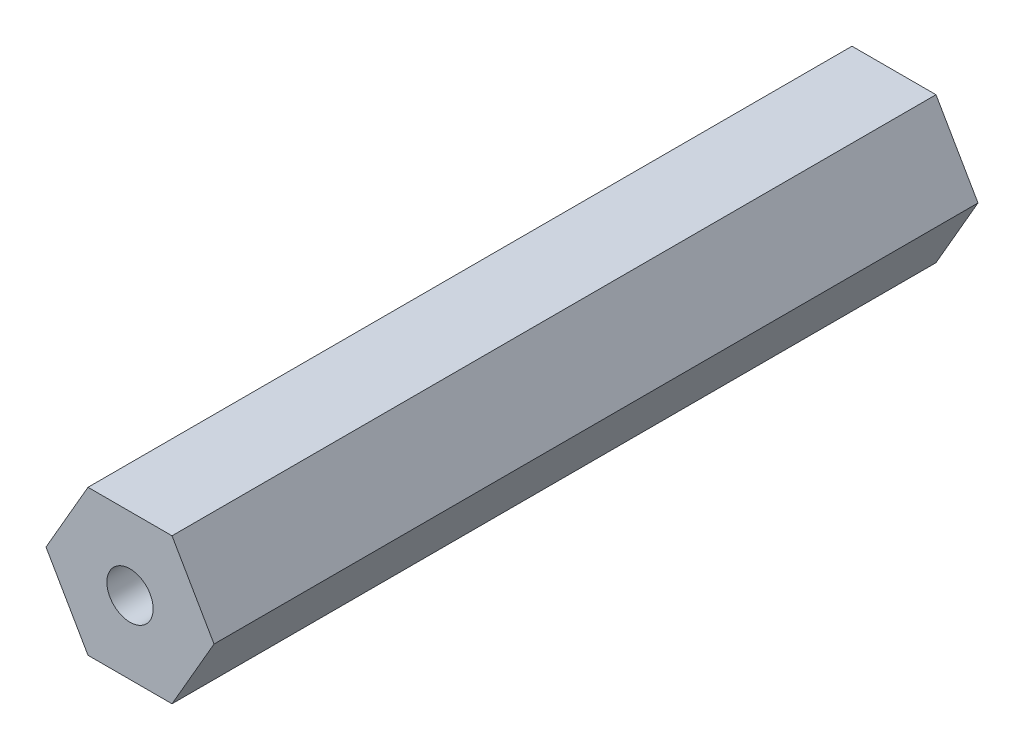
ISO-10303-21;
HEADER;
FILE_DESCRIPTION(('STEP AP214'),'2;1');
FILE_NAME('part.step','',(''),(''),'','','');
FILE_SCHEMA(('AUTOMOTIVE_DESIGN { 1 0 10303 214 1 1 1 1 }'));
ENDSEC;
DATA;
#1=APPLICATION_CONTEXT('core data for automotive mechanical design processes');
#2=APPLICATION_PROTOCOL_DEFINITION('international standard','automotive_design',2000,#1);
#3=PRODUCT_CONTEXT('',#1,'mechanical');
#4=PRODUCT('Part','Part','',(#3));
#5=PRODUCT_RELATED_PRODUCT_CATEGORY('part','',(#4));
#6=PRODUCT_DEFINITION_FORMATION('','',#4);
#7=PRODUCT_DEFINITION_CONTEXT('part definition',#1,'design');
#8=PRODUCT_DEFINITION('design','',#6,#7);
#9=PRODUCT_DEFINITION_SHAPE('','',#8);
#10=(LENGTH_UNIT() NAMED_UNIT(*) SI_UNIT(.MILLI.,.METRE.));
#11=(NAMED_UNIT(*) PLANE_ANGLE_UNIT() SI_UNIT($,.RADIAN.));
#12=(NAMED_UNIT(*) SI_UNIT($,.STERADIAN.) SOLID_ANGLE_UNIT());
#13=UNCERTAINTY_MEASURE_WITH_UNIT(LENGTH_MEASURE(1.E-05),#10,'distance_accuracy_value','');
#14=(GEOMETRIC_REPRESENTATION_CONTEXT(3) GLOBAL_UNCERTAINTY_ASSIGNED_CONTEXT((#13)) GLOBAL_UNIT_ASSIGNED_CONTEXT((#10,
#11,#12)) REPRESENTATION_CONTEXT('',''));
#15=CARTESIAN_POINT('',(0.,0.,0.));
#16=DIRECTION('',(0.,0.,1.));
#17=DIRECTION('',(1.,0.,0.));
#18=AXIS2_PLACEMENT_3D('',#15,#16,#17);
#19=CARTESIAN_POINT('',(-3.66617420935412,6.35,33.3375));
#20=DIRECTION('',(0.866025403784439,-0.5,0.));
#21=DIRECTION('',(0.5,0.866025403784439,0.));
#22=AXIS2_PLACEMENT_3D('',#19,#20,#21);
#23=PLANE('',#22);
#24=DIRECTION('',(-0.5,-0.866025403784439,0.));
#25=VECTOR('',#24,1.);
#26=CARTESIAN_POINT('',(-3.66617420935412,6.35,-33.3375));
#27=LINE('',#26,#25);
#28=CARTESIAN_POINT('',(-3.66617420935412,6.35,-33.3375));
#29=VERTEX_POINT('',#28);
#30=CARTESIAN_POINT('',(-7.33234841870825,0.,-33.3375));
#31=VERTEX_POINT('',#30);
#32=EDGE_CURVE('E128',#29,#31,#27,.T.);
#33=ORIENTED_EDGE('',*,*,#32,.T.);
#34=DIRECTION('',(0.,0.,-1.));
#35=VECTOR('',#34,1.);
#36=CARTESIAN_POINT('',(-7.33234841870825,0.,33.3375));
#37=LINE('',#36,#35);
#38=CARTESIAN_POINT('',(-7.33234841870825,0.,33.3375));
#39=VERTEX_POINT('',#38);
#40=EDGE_CURVE('E11',#39,#31,#37,.T.);
#41=ORIENTED_EDGE('',*,*,#40,.F.);
#42=DIRECTION('',(-0.5,-0.866025403784439,0.));
#43=VECTOR('',#42,1.);
#44=CARTESIAN_POINT('',(-3.66617420935412,6.35,33.3375));
#45=LINE('',#44,#43);
#46=CARTESIAN_POINT('',(-3.66617420935412,6.35,33.3375));
#47=VERTEX_POINT('',#46);
#48=EDGE_CURVE('E139',#47,#39,#45,.T.);
#49=ORIENTED_EDGE('',*,*,#48,.F.);
#50=DIRECTION('',(0.,0.,-1.));
#51=VECTOR('',#50,1.);
#52=CARTESIAN_POINT('',(-3.66617420935412,6.35,33.3375));
#53=LINE('',#52,#51);
#54=EDGE_CURVE('E124',#47,#29,#53,.T.);
#55=ORIENTED_EDGE('',*,*,#54,.T.);
#56=EDGE_LOOP('',(#33,#41,#49,#55));
#57=FACE_BOUND('',#56,.T.);
#58=ADVANCED_FACE('F41',(#57),#23,.F.);
#59=CARTESIAN_POINT('',(-7.33234841870825,0.,33.3375));
#60=DIRECTION('',(0.866025403784439,0.5,0.));
#61=DIRECTION('',(-0.5,0.866025403784439,0.));
#62=AXIS2_PLACEMENT_3D('',#59,#60,#61);
#63=PLANE('',#62);
#64=DIRECTION('',(0.5,-0.866025403784439,0.));
#65=VECTOR('',#64,1.);
#66=CARTESIAN_POINT('',(-7.33234841870825,0.,-33.3375));
#67=LINE('',#66,#65);
#68=CARTESIAN_POINT('',(-3.66617420935412,-6.35,-33.3375));
#69=VERTEX_POINT('',#68);
#70=EDGE_CURVE('E131',#31,#69,#67,.T.);
#71=ORIENTED_EDGE('',*,*,#70,.T.);
#72=DIRECTION('',(0.,0.,-1.));
#73=VECTOR('',#72,1.);
#74=CARTESIAN_POINT('',(-3.66617420935412,-6.35,33.3375));
#75=LINE('',#74,#73);
#76=CARTESIAN_POINT('',(-3.66617420935412,-6.35,33.3375));
#77=VERTEX_POINT('',#76);
#78=EDGE_CURVE('E49',#77,#69,#75,.T.);
#79=ORIENTED_EDGE('',*,*,#78,.F.);
#80=DIRECTION('',(0.5,-0.866025403784439,0.));
#81=VECTOR('',#80,1.);
#82=CARTESIAN_POINT('',(-7.33234841870825,0.,33.3375));
#83=LINE('',#82,#81);
#84=EDGE_CURVE('E95',#39,#77,#83,.T.);
#85=ORIENTED_EDGE('',*,*,#84,.F.);
#86=ORIENTED_EDGE('',*,*,#40,.T.);
#87=EDGE_LOOP('',(#71,#79,#85,#86));
#88=FACE_BOUND('',#87,.T.);
#89=ADVANCED_FACE('F164',(#88),#63,.F.);
#90=CARTESIAN_POINT('',(-3.66617420935412,-6.35,33.3375));
#91=DIRECTION('',(0.,1.,0.));
#92=DIRECTION('',(-1.,0.,0.));
#93=AXIS2_PLACEMENT_3D('',#90,#91,#92);
#94=PLANE('',#93);
#95=DIRECTION('',(1.,0.,0.));
#96=VECTOR('',#95,1.);
#97=CARTESIAN_POINT('',(-3.66617420935412,-6.35,-33.3375));
#98=LINE('',#97,#96);
#99=CARTESIAN_POINT('',(3.66617420935413,-6.35,-33.3375));
#100=VERTEX_POINT('',#99);
#101=EDGE_CURVE('E134',#69,#100,#98,.T.);
#102=ORIENTED_EDGE('',*,*,#101,.T.);
#103=DIRECTION('',(0.,0.,-1.));
#104=VECTOR('',#103,1.);
#105=CARTESIAN_POINT('',(3.66617420935413,-6.35,33.3375));
#106=LINE('',#105,#104);
#107=CARTESIAN_POINT('',(3.66617420935413,-6.35,33.3375));
#108=VERTEX_POINT('',#107);
#109=EDGE_CURVE('E119',#108,#100,#106,.T.);
#110=ORIENTED_EDGE('',*,*,#109,.F.);
#111=DIRECTION('',(1.,0.,0.));
#112=VECTOR('',#111,1.);
#113=CARTESIAN_POINT('',(-3.66617420935412,-6.35,33.3375));
#114=LINE('',#113,#112);
#115=EDGE_CURVE('E110',#77,#108,#114,.T.);
#116=ORIENTED_EDGE('',*,*,#115,.F.);
#117=ORIENTED_EDGE('',*,*,#78,.T.);
#118=EDGE_LOOP('',(#102,#110,#116,#117));
#119=FACE_BOUND('',#118,.T.);
#120=ADVANCED_FACE('F145',(#119),#94,.F.);
#121=CARTESIAN_POINT('',(3.66617420935413,-6.35,33.3375));
#122=DIRECTION('',(-0.866025403784439,0.5,0.));
#123=DIRECTION('',(-0.5,-0.866025403784439,0.));
#124=AXIS2_PLACEMENT_3D('',#121,#122,#123);
#125=PLANE('',#124);
#126=DIRECTION('',(0.5,0.866025403784439,0.));
#127=VECTOR('',#126,1.);
#128=CARTESIAN_POINT('',(3.66617420935413,-6.35,-33.3375));
#129=LINE('',#128,#127);
#130=CARTESIAN_POINT('',(7.33234841870825,0.,-33.3375));
#131=VERTEX_POINT('',#130);
#132=EDGE_CURVE('E118',#100,#131,#129,.T.);
#133=ORIENTED_EDGE('',*,*,#132,.T.);
#134=DIRECTION('',(0.,0.,-1.));
#135=VECTOR('',#134,1.);
#136=CARTESIAN_POINT('',(7.33234841870825,0.,33.3375));
#137=LINE('',#136,#135);
#138=CARTESIAN_POINT('',(7.33234841870825,0.,33.3375));
#139=VERTEX_POINT('',#138);
#140=EDGE_CURVE('E115',#139,#131,#137,.T.);
#141=ORIENTED_EDGE('',*,*,#140,.F.);
#142=DIRECTION('',(0.5,0.866025403784439,0.));
#143=VECTOR('',#142,1.);
#144=CARTESIAN_POINT('',(3.66617420935413,-6.35,33.3375));
#145=LINE('',#144,#143);
#146=EDGE_CURVE('E104',#108,#139,#145,.T.);
#147=ORIENTED_EDGE('',*,*,#146,.F.);
#148=ORIENTED_EDGE('',*,*,#109,.T.);
#149=EDGE_LOOP('',(#133,#141,#147,#148));
#150=FACE_BOUND('',#149,.T.);
#151=ADVANCED_FACE('F116',(#150),#125,.F.);
#152=CARTESIAN_POINT('',(7.33234841870825,0.,33.3375));
#153=DIRECTION('',(-0.866025403784439,-0.5,0.));
#154=DIRECTION('',(0.5,-0.866025403784439,0.));
#155=AXIS2_PLACEMENT_3D('',#152,#153,#154);
#156=PLANE('',#155);
#157=DIRECTION('',(-0.5,0.866025403784439,0.));
#158=VECTOR('',#157,1.);
#159=CARTESIAN_POINT('',(7.33234841870825,0.,-33.3375));
#160=LINE('',#159,#158);
#161=CARTESIAN_POINT('',(3.66617420935413,6.35,-33.3375));
#162=VERTEX_POINT('',#161);
#163=EDGE_CURVE('E81',#131,#162,#160,.T.);
#164=ORIENTED_EDGE('',*,*,#163,.T.);
#165=DIRECTION('',(0.,0.,-1.));
#166=VECTOR('',#165,1.);
#167=CARTESIAN_POINT('',(3.66617420935413,6.35,33.3375));
#168=LINE('',#167,#166);
#169=CARTESIAN_POINT('',(3.66617420935413,6.35,33.3375));
#170=VERTEX_POINT('',#169);
#171=EDGE_CURVE('E120',#170,#162,#168,.T.);
#172=ORIENTED_EDGE('',*,*,#171,.F.);
#173=DIRECTION('',(-0.5,0.866025403784439,0.));
#174=VECTOR('',#173,1.);
#175=CARTESIAN_POINT('',(7.33234841870825,0.,33.3375));
#176=LINE('',#175,#174);
#177=EDGE_CURVE('E108',#139,#170,#176,.T.);
#178=ORIENTED_EDGE('',*,*,#177,.F.);
#179=ORIENTED_EDGE('',*,*,#140,.T.);
#180=EDGE_LOOP('',(#164,#172,#178,#179));
#181=FACE_BOUND('',#180,.T.);
#182=ADVANCED_FACE('F122',(#181),#156,.F.);
#183=CARTESIAN_POINT('',(3.66617420935413,6.35,33.3375));
#184=DIRECTION('',(0.,-1.,0.));
#185=DIRECTION('',(1.,0.,0.));
#186=AXIS2_PLACEMENT_3D('',#183,#184,#185);
#187=PLANE('',#186);
#188=DIRECTION('',(-1.,0.,0.));
#189=VECTOR('',#188,1.);
#190=CARTESIAN_POINT('',(3.66617420935413,6.35,-33.3375));
#191=LINE('',#190,#189);
#192=EDGE_CURVE('E87',#162,#29,#191,.T.);
#193=ORIENTED_EDGE('',*,*,#192,.T.);
#194=ORIENTED_EDGE('',*,*,#54,.F.);
#195=DIRECTION('',(-1.,0.,0.));
#196=VECTOR('',#195,1.);
#197=CARTESIAN_POINT('',(3.66617420935413,6.35,33.3375));
#198=LINE('',#197,#196);
#199=EDGE_CURVE('E57',#170,#47,#198,.T.);
#200=ORIENTED_EDGE('',*,*,#199,.F.);
#201=ORIENTED_EDGE('',*,*,#171,.T.);
#202=EDGE_LOOP('',(#193,#194,#200,#201));
#203=FACE_BOUND('',#202,.T.);
#204=ADVANCED_FACE('F152',(#203),#187,.F.);
#205=CARTESIAN_POINT('',(0.,0.,33.3375));
#206=DIRECTION('',(0.,0.,1.));
#207=DIRECTION('',(1.,0.,0.));
#208=AXIS2_PLACEMENT_3D('',#205,#206,#207);
#209=PLANE('',#208);
#210=CARTESIAN_POINT('',(0.,0.,33.3375));
#211=DIRECTION('',(0.,0.,1.));
#212=DIRECTION('',(1.,0.,0.));
#213=AXIS2_PLACEMENT_3D('',#210,#211,#212);
#214=CIRCLE('',#213,2.01929999999999);
#215=CARTESIAN_POINT('',(2.01929999999999,0.,33.3375));
#216=VERTEX_POINT('',#215);
#217=EDGE_CURVE('E266',#216,#216,#214,.T.);
#218=ORIENTED_EDGE('',*,*,#217,.F.);
#219=EDGE_LOOP('',(#218));
#220=FACE_BOUND('',#219,.T.);
#221=ORIENTED_EDGE('',*,*,#48,.T.);
#222=ORIENTED_EDGE('',*,*,#84,.T.);
#223=ORIENTED_EDGE('',*,*,#115,.T.);
#224=ORIENTED_EDGE('',*,*,#146,.T.);
#225=ORIENTED_EDGE('',*,*,#177,.T.);
#226=ORIENTED_EDGE('',*,*,#199,.T.);
#227=EDGE_LOOP('',(#221,#222,#223,#224,#225,#226));
#228=FACE_BOUND('',#227,.T.);
#229=ADVANCED_FACE('F106',(#220,#228),#209,.T.);
#230=CARTESIAN_POINT('',(0.,0.,-33.3375));
#231=DIRECTION('',(0.,0.,1.));
#232=DIRECTION('',(1.,0.,0.));
#233=AXIS2_PLACEMENT_3D('',#230,#231,#232);
#234=PLANE('',#233);
#235=CARTESIAN_POINT('',(0.,0.,-33.3375));
#236=DIRECTION('',(0.,0.,-1.));
#237=DIRECTION('',(-1.,0.,0.));
#238=AXIS2_PLACEMENT_3D('',#235,#236,#237);
#239=CIRCLE('',#238,2.01929999999999);
#240=CARTESIAN_POINT('',(-2.01929999999999,0.,-33.3375));
#241=VERTEX_POINT('',#240);
#242=EDGE_CURVE('E268',#241,#241,#239,.T.);
#243=ORIENTED_EDGE('',*,*,#242,.F.);
#244=EDGE_LOOP('',(#243));
#245=FACE_BOUND('',#244,.T.);
#246=ORIENTED_EDGE('',*,*,#32,.F.);
#247=ORIENTED_EDGE('',*,*,#192,.F.);
#248=ORIENTED_EDGE('',*,*,#163,.F.);
#249=ORIENTED_EDGE('',*,*,#132,.F.);
#250=ORIENTED_EDGE('',*,*,#101,.F.);
#251=ORIENTED_EDGE('',*,*,#70,.F.);
#252=EDGE_LOOP('',(#246,#247,#248,#249,#250,#251));
#253=FACE_BOUND('',#252,.T.);
#254=ADVANCED_FACE('F148',(#245,#253),#234,.F.);
#255=CARTESIAN_POINT('',(0.,0.,-21.3995));
#256=DIRECTION('',(0.,0.,-1.));
#257=DIRECTION('',(-1.,0.,0.));
#258=AXIS2_PLACEMENT_3D('',#255,#256,#257);
#259=CONICAL_SURFACE('',#258,2.01929999999999,1.02974425867665);
#260=CARTESIAN_POINT('',(0.,0.,-20.1861821519976));
#261=VERTEX_POINT('',#260);
#262=VERTEX_LOOP('',#261);
#263=FACE_BOUND('',#262,.T.);
#264=CARTESIAN_POINT('',(0.,0.,-21.3995));
#265=DIRECTION('',(0.,0.,-1.));
#266=DIRECTION('',(-1.,0.,0.));
#267=AXIS2_PLACEMENT_3D('',#264,#265,#266);
#268=CIRCLE('',#267,2.01929999999999);
#269=CARTESIAN_POINT('',(-2.01929999999999,0.,-21.3995));
#270=VERTEX_POINT('',#269);
#271=EDGE_CURVE('E132',#270,#270,#268,.T.);
#272=ORIENTED_EDGE('',*,*,#271,.T.);
#273=EDGE_LOOP('',(#272));
#274=FACE_BOUND('',#273,.T.);
#275=ADVANCED_FACE('F205',(#263,#274),#259,.F.);
#276=CARTESIAN_POINT('',(0.,0.,-33.3375));
#277=DIRECTION('',(0.,0.,-1.));
#278=DIRECTION('',(-1.,0.,0.));
#279=AXIS2_PLACEMENT_3D('',#276,#277,#278);
#280=CYLINDRICAL_SURFACE('',#279,2.01929999999999);
#281=ORIENTED_EDGE('',*,*,#271,.F.);
#282=EDGE_LOOP('',(#281));
#283=FACE_BOUND('',#282,.T.);
#284=ORIENTED_EDGE('',*,*,#242,.T.);
#285=EDGE_LOOP('',(#284));
#286=FACE_BOUND('',#285,.T.);
#287=ADVANCED_FACE('F216',(#283,#286),#280,.F.);
#288=CARTESIAN_POINT('',(0.,0.,21.3995));
#289=DIRECTION('',(0.,0.,1.));
#290=DIRECTION('',(1.,0.,0.));
#291=AXIS2_PLACEMENT_3D('',#288,#289,#290);
#292=CONICAL_SURFACE('',#291,2.01929999999999,1.02974425867665);
#293=CARTESIAN_POINT('',(0.,0.,20.1861821519976));
#294=VERTEX_POINT('',#293);
#295=VERTEX_LOOP('',#294);
#296=FACE_BOUND('',#295,.T.);
#297=CARTESIAN_POINT('',(0.,0.,21.3995));
#298=DIRECTION('',(0.,0.,1.));
#299=DIRECTION('',(1.,0.,0.));
#300=AXIS2_PLACEMENT_3D('',#297,#298,#299);
#301=CIRCLE('',#300,2.01929999999999);
#302=CARTESIAN_POINT('',(2.01929999999999,0.,21.3995));
#303=VERTEX_POINT('',#302);
#304=EDGE_CURVE('E263',#303,#303,#301,.T.);
#305=ORIENTED_EDGE('',*,*,#304,.T.);
#306=EDGE_LOOP('',(#305));
#307=FACE_BOUND('',#306,.T.);
#308=ADVANCED_FACE('F227',(#296,#307),#292,.F.);
#309=CARTESIAN_POINT('',(0.,0.,33.3375));
#310=DIRECTION('',(0.,0.,1.));
#311=DIRECTION('',(1.,0.,0.));
#312=AXIS2_PLACEMENT_3D('',#309,#310,#311);
#313=CYLINDRICAL_SURFACE('',#312,2.01929999999999);
#314=ORIENTED_EDGE('',*,*,#304,.F.);
#315=EDGE_LOOP('',(#314));
#316=FACE_BOUND('',#315,.T.);
#317=ORIENTED_EDGE('',*,*,#217,.T.);
#318=EDGE_LOOP('',(#317));
#319=FACE_BOUND('',#318,.T.);
#320=ADVANCED_FACE('F238',(#316,#319),#313,.F.);
#321=CLOSED_SHELL('',(#58,#89,#120,#151,#182,#204,#229,#254,#275,#287,#308,#320));
#322=MANIFOLD_SOLID_BREP('B2',#321);
#323=ADVANCED_BREP_SHAPE_REPRESENTATION('',(#18,#322),#14);
#324=SHAPE_DEFINITION_REPRESENTATION(#9,#323);
ENDSEC;
END-ISO-10303-21;
